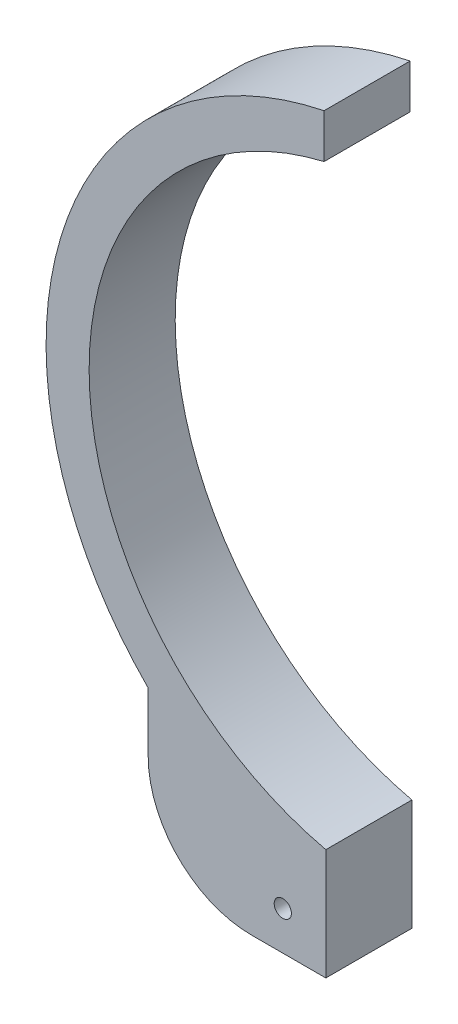
ISO-10303-21;
HEADER;
FILE_DESCRIPTION(('STEP AP214'),'2;1');
FILE_NAME('part.step','',(''),(''),'','','');
FILE_SCHEMA(('AUTOMOTIVE_DESIGN { 1 0 10303 214 1 1 1 1 }'));
ENDSEC;
DATA;
#1=APPLICATION_CONTEXT('core data for automotive mechanical design processes');
#2=APPLICATION_PROTOCOL_DEFINITION('international standard','automotive_design',2000,#1);
#3=PRODUCT_CONTEXT('',#1,'mechanical');
#4=PRODUCT('Part','Part','',(#3));
#5=PRODUCT_RELATED_PRODUCT_CATEGORY('part','',(#4));
#6=PRODUCT_DEFINITION_FORMATION('','',#4);
#7=PRODUCT_DEFINITION_CONTEXT('part definition',#1,'design');
#8=PRODUCT_DEFINITION('design','',#6,#7);
#9=PRODUCT_DEFINITION_SHAPE('','',#8);
#10=(LENGTH_UNIT() NAMED_UNIT(*) SI_UNIT(.MILLI.,.METRE.));
#11=(NAMED_UNIT(*) PLANE_ANGLE_UNIT() SI_UNIT($,.RADIAN.));
#12=(NAMED_UNIT(*) SI_UNIT($,.STERADIAN.) SOLID_ANGLE_UNIT());
#13=UNCERTAINTY_MEASURE_WITH_UNIT(LENGTH_MEASURE(1.E-05),#10,'distance_accuracy_value','');
#14=(GEOMETRIC_REPRESENTATION_CONTEXT(3) GLOBAL_UNCERTAINTY_ASSIGNED_CONTEXT((#13)) GLOBAL_UNIT_ASSIGNED_CONTEXT((#10,
#11,#12)) REPRESENTATION_CONTEXT('',''));
#15=CARTESIAN_POINT('',(0.,0.,0.));
#16=DIRECTION('',(0.,0.,1.));
#17=DIRECTION('',(1.,0.,0.));
#18=AXIS2_PLACEMENT_3D('',#15,#16,#17);
#19=CARTESIAN_POINT('',(0.,-47.5,10.));
#20=DIRECTION('',(0.,1.,0.));
#21=DIRECTION('',(0.,0.,1.));
#22=AXIS2_PLACEMENT_3D('',#19,#20,#21);
#23=PLANE('',#22);
#24=DIRECTION('',(1.,0.,0.));
#25=VECTOR('',#24,1.);
#26=CARTESIAN_POINT('',(0.,-47.5,0.));
#27=LINE('',#26,#25);
#28=CARTESIAN_POINT('',(-16.6378246380552,-47.5,0.));
#29=VERTEX_POINT('',#28);
#30=CARTESIAN_POINT('',(-8.,-47.5,0.));
#31=VERTEX_POINT('',#30);
#32=EDGE_CURVE('E129',#29,#31,#27,.T.);
#33=ORIENTED_EDGE('',*,*,#32,.T.);
#34=DIRECTION('',(0.,0.,-1.));
#35=VECTOR('',#34,1.);
#36=CARTESIAN_POINT('',(-8.,-47.5,10.));
#37=LINE('',#36,#35);
#38=CARTESIAN_POINT('',(-8.,-47.5,10.));
#39=VERTEX_POINT('',#38);
#40=EDGE_CURVE('E42',#39,#31,#37,.T.);
#41=ORIENTED_EDGE('',*,*,#40,.F.);
#42=DIRECTION('',(1.,0.,0.));
#43=VECTOR('',#42,1.);
#44=CARTESIAN_POINT('',(0.,-47.5,10.));
#45=LINE('',#44,#43);
#46=CARTESIAN_POINT('',(-16.6378246380552,-47.5,10.));
#47=VERTEX_POINT('',#46);
#48=EDGE_CURVE('E87',#47,#39,#45,.T.);
#49=ORIENTED_EDGE('',*,*,#48,.F.);
#50=DIRECTION('',(0.,0.,-1.));
#51=VECTOR('',#50,1.);
#52=CARTESIAN_POINT('',(-16.6378246380552,-47.5,10.));
#53=LINE('',#52,#51);
#54=EDGE_CURVE('E122',#47,#29,#53,.T.);
#55=ORIENTED_EDGE('',*,*,#54,.T.);
#56=EDGE_LOOP('',(#33,#41,#49,#55));
#57=FACE_BOUND('',#56,.T.);
#58=ADVANCED_FACE('F34',(#57),#23,.F.);
#59=CARTESIAN_POINT('',(-8.00000000000001,0.,10.));
#60=DIRECTION('',(1.,0.,0.));
#61=DIRECTION('',(0.,1.,0.));
#62=AXIS2_PLACEMENT_3D('',#59,#60,#61);
#63=PLANE('',#62);
#64=DIRECTION('',(0.,-1.,0.));
#65=VECTOR('',#64,1.);
#66=CARTESIAN_POINT('',(-8.00000000000001,0.,0.));
#67=LINE('',#66,#65);
#68=CARTESIAN_POINT('',(-8.,-34.5868472110425,0.));
#69=VERTEX_POINT('',#68);
#70=EDGE_CURVE('E132',#69,#31,#67,.T.);
#71=ORIENTED_EDGE('',*,*,#70,.F.);
#72=DIRECTION('',(0.,0.,-1.));
#73=VECTOR('',#72,1.);
#74=CARTESIAN_POINT('',(-8.,-34.5868472110425,10.));
#75=LINE('',#74,#73);
#76=CARTESIAN_POINT('',(-8.,-34.5868472110425,10.));
#77=VERTEX_POINT('',#76);
#78=EDGE_CURVE('E117',#77,#69,#75,.T.);
#79=ORIENTED_EDGE('',*,*,#78,.F.);
#80=DIRECTION('',(0.,-1.,0.));
#81=VECTOR('',#80,1.);
#82=CARTESIAN_POINT('',(-8.00000000000001,0.,10.));
#83=LINE('',#82,#81);
#84=EDGE_CURVE('E150',#77,#39,#83,.T.);
#85=ORIENTED_EDGE('',*,*,#84,.T.);
#86=ORIENTED_EDGE('',*,*,#40,.T.);
#87=EDGE_LOOP('',(#71,#79,#85,#86));
#88=FACE_BOUND('',#87,.T.);
#89=ADVANCED_FACE('F148',(#88),#63,.T.);
#90=CARTESIAN_POINT('',(0.,0.,10.));
#91=DIRECTION('',(0.,0.,-1.));
#92=DIRECTION('',(-1.,0.,0.));
#93=AXIS2_PLACEMENT_3D('',#90,#91,#92);
#94=CYLINDRICAL_SURFACE('',#93,35.5);
#95=DIRECTION('',(0.,0.,-1.));
#96=VECTOR('',#95,1.);
#97=CARTESIAN_POINT('',(-8.20400235630876,34.5390264098118,10.));
#98=LINE('',#97,#96);
#99=CARTESIAN_POINT('',(-8.20400235630876,34.5390264098118,10.));
#100=VERTEX_POINT('',#99);
#101=CARTESIAN_POINT('',(-8.20400235630876,34.5390264098118,0.));
#102=VERTEX_POINT('',#101);
#103=EDGE_CURVE('E49',#100,#102,#98,.T.);
#104=ORIENTED_EDGE('',*,*,#103,.F.);
#105=CARTESIAN_POINT('',(0.,0.,10.));
#106=DIRECTION('',(0.,0.,1.));
#107=DIRECTION('',(1.,0.,0.));
#108=AXIS2_PLACEMENT_3D('',#105,#106,#107);
#109=CIRCLE('',#108,35.5);
#110=EDGE_CURVE('E108',#100,#77,#109,.T.);
#111=ORIENTED_EDGE('',*,*,#110,.T.);
#112=ORIENTED_EDGE('',*,*,#78,.T.);
#113=CARTESIAN_POINT('',(0.,0.,0.));
#114=DIRECTION('',(0.,0.,1.));
#115=DIRECTION('',(1.,0.,0.));
#116=AXIS2_PLACEMENT_3D('',#113,#114,#115);
#117=CIRCLE('',#116,35.5);
#118=EDGE_CURVE('E135',#102,#69,#117,.T.);
#119=ORIENTED_EDGE('',*,*,#118,.F.);
#120=EDGE_LOOP('',(#104,#111,#112,#119));
#121=FACE_BOUND('',#120,.T.);
#122=ADVANCED_FACE('F157',(#121),#94,.F.);
#123=CARTESIAN_POINT('',(0.,0.,10.));
#124=DIRECTION('',(0.,0.,-1.));
#125=DIRECTION('',(-1.,0.,0.));
#126=AXIS2_PLACEMENT_3D('',#123,#124,#125);
#127=CYLINDRICAL_SURFACE('',#126,40.5);
#128=CARTESIAN_POINT('',(0.,0.,10.));
#129=DIRECTION('',(0.,0.,1.));
#130=DIRECTION('',(1.,0.,0.));
#131=AXIS2_PLACEMENT_3D('',#128,#129,#130);
#132=CIRCLE('',#131,40.5);
#133=CARTESIAN_POINT('',(-8.20400235630876,39.6603623954406,10.));
#134=VERTEX_POINT('',#133);
#135=CARTESIAN_POINT('',(-28.6378246380552,-28.6378246380552,10.));
#136=VERTEX_POINT('',#135);
#137=EDGE_CURVE('E96',#134,#136,#132,.T.);
#138=ORIENTED_EDGE('',*,*,#137,.F.);
#139=DIRECTION('',(0.,0.,-1.));
#140=VECTOR('',#139,1.);
#141=CARTESIAN_POINT('',(-8.20400235630876,39.6603623954406,10.));
#142=LINE('',#141,#140);
#143=CARTESIAN_POINT('',(-8.20400235630876,39.6603623954406,0.));
#144=VERTEX_POINT('',#143);
#145=EDGE_CURVE('E165',#134,#144,#142,.T.);
#146=ORIENTED_EDGE('',*,*,#145,.T.);
#147=CARTESIAN_POINT('',(0.,0.,0.));
#148=DIRECTION('',(0.,0.,1.));
#149=DIRECTION('',(1.,0.,0.));
#150=AXIS2_PLACEMENT_3D('',#147,#148,#149);
#151=CIRCLE('',#150,40.5);
#152=CARTESIAN_POINT('',(-28.6378246380552,-28.6378246380552,0.));
#153=VERTEX_POINT('',#152);
#154=EDGE_CURVE('E114',#144,#153,#151,.T.);
#155=ORIENTED_EDGE('',*,*,#154,.T.);
#156=DIRECTION('',(0.,0.,-1.));
#157=VECTOR('',#156,1.);
#158=CARTESIAN_POINT('',(-28.6378246380552,-28.6378246380552,10.));
#159=LINE('',#158,#157);
#160=EDGE_CURVE('E111',#136,#153,#159,.T.);
#161=ORIENTED_EDGE('',*,*,#160,.F.);
#162=EDGE_LOOP('',(#138,#146,#155,#161));
#163=FACE_BOUND('',#162,.T.);
#164=ADVANCED_FACE('F112',(#163),#127,.T.);
#165=CARTESIAN_POINT('',(-28.6378246380552,0.,10.));
#166=DIRECTION('',(1.,0.,0.));
#167=DIRECTION('',(0.,1.,0.));
#168=AXIS2_PLACEMENT_3D('',#165,#166,#167);
#169=PLANE('',#168);
#170=DIRECTION('',(0.,-1.,0.));
#171=VECTOR('',#170,1.);
#172=CARTESIAN_POINT('',(-28.6378246380552,0.,0.));
#173=LINE('',#172,#171);
#174=CARTESIAN_POINT('',(-28.6378246380552,-35.5,0.));
#175=VERTEX_POINT('',#174);
#176=EDGE_CURVE('E138',#153,#175,#173,.T.);
#177=ORIENTED_EDGE('',*,*,#176,.T.);
#178=DIRECTION('',(0.,0.,-1.));
#179=VECTOR('',#178,1.);
#180=CARTESIAN_POINT('',(-28.6378246380552,-35.5,10.));
#181=LINE('',#180,#179);
#182=CARTESIAN_POINT('',(-28.6378246380552,-35.5,10.));
#183=VERTEX_POINT('',#182);
#184=EDGE_CURVE('E118',#183,#175,#181,.T.);
#185=ORIENTED_EDGE('',*,*,#184,.F.);
#186=DIRECTION('',(0.,-1.,0.));
#187=VECTOR('',#186,1.);
#188=CARTESIAN_POINT('',(-28.6378246380552,0.,10.));
#189=LINE('',#188,#187);
#190=EDGE_CURVE('E101',#136,#183,#189,.T.);
#191=ORIENTED_EDGE('',*,*,#190,.F.);
#192=ORIENTED_EDGE('',*,*,#160,.T.);
#193=EDGE_LOOP('',(#177,#185,#191,#192));
#194=FACE_BOUND('',#193,.T.);
#195=ADVANCED_FACE('F120',(#194),#169,.F.);
#196=CARTESIAN_POINT('',(-13.,-42.9998768280213,10.));
#197=DIRECTION('',(0.,0.,-1.));
#198=DIRECTION('',(-1.,0.,0.));
#199=AXIS2_PLACEMENT_3D('',#196,#197,#198);
#200=CYLINDRICAL_SURFACE('',#199,1.);
#201=CARTESIAN_POINT('',(-13.,-42.9998768280213,10.));
#202=DIRECTION('',(0.,0.,1.));
#203=DIRECTION('',(1.,0.,0.));
#204=AXIS2_PLACEMENT_3D('',#201,#202,#203);
#205=CIRCLE('',#204,1.);
#206=CARTESIAN_POINT('',(-12.,-42.9998768280213,10.));
#207=VERTEX_POINT('',#206);
#208=EDGE_CURVE('E141',#207,#207,#205,.T.);
#209=ORIENTED_EDGE('',*,*,#208,.T.);
#210=EDGE_LOOP('',(#209));
#211=FACE_BOUND('',#210,.T.);
#212=CARTESIAN_POINT('',(-13.,-42.9998768280213,0.));
#213=DIRECTION('',(0.,0.,1.));
#214=DIRECTION('',(1.,0.,0.));
#215=AXIS2_PLACEMENT_3D('',#212,#213,#214);
#216=CIRCLE('',#215,1.);
#217=CARTESIAN_POINT('',(-12.,-42.9998768280213,0.));
#218=VERTEX_POINT('',#217);
#219=EDGE_CURVE('E126',#218,#218,#216,.T.);
#220=ORIENTED_EDGE('',*,*,#219,.F.);
#221=EDGE_LOOP('',(#220));
#222=FACE_BOUND('',#221,.T.);
#223=ADVANCED_FACE('F36',(#211,#222),#200,.F.);
#224=CARTESIAN_POINT('',(-16.6378246380552,-35.5,10.));
#225=DIRECTION('',(0.,0.,-1.));
#226=DIRECTION('',(-1.,0.,0.));
#227=AXIS2_PLACEMENT_3D('',#224,#225,#226);
#228=CYLINDRICAL_SURFACE('',#227,12.);
#229=CARTESIAN_POINT('',(-16.6378246380552,-35.5,0.));
#230=DIRECTION('',(0.,0.,1.));
#231=DIRECTION('',(1.,0.,0.));
#232=AXIS2_PLACEMENT_3D('',#229,#230,#231);
#233=CIRCLE('',#232,12.);
#234=EDGE_CURVE('E81',#175,#29,#233,.T.);
#235=ORIENTED_EDGE('',*,*,#234,.T.);
#236=ORIENTED_EDGE('',*,*,#54,.F.);
#237=CARTESIAN_POINT('',(-16.6378246380552,-35.5,10.));
#238=DIRECTION('',(0.,0.,1.));
#239=DIRECTION('',(1.,0.,0.));
#240=AXIS2_PLACEMENT_3D('',#237,#238,#239);
#241=CIRCLE('',#240,12.);
#242=EDGE_CURVE('E57',#183,#47,#241,.T.);
#243=ORIENTED_EDGE('',*,*,#242,.F.);
#244=ORIENTED_EDGE('',*,*,#184,.T.);
#245=EDGE_LOOP('',(#235,#236,#243,#244));
#246=FACE_BOUND('',#245,.T.);
#247=ADVANCED_FACE('F170',(#246),#228,.T.);
#248=CARTESIAN_POINT('',(0.,0.,10.));
#249=DIRECTION('',(0.,0.,1.));
#250=DIRECTION('',(1.,0.,0.));
#251=AXIS2_PLACEMENT_3D('',#248,#249,#250);
#252=PLANE('',#251);
#253=DIRECTION('',(0.,-1.,0.));
#254=VECTOR('',#253,1.);
#255=CARTESIAN_POINT('',(-8.20400235630876,40.5,10.));
#256=LINE('',#255,#254);
#257=EDGE_CURVE('E105',#134,#100,#256,.T.);
#258=ORIENTED_EDGE('',*,*,#257,.F.);
#259=ORIENTED_EDGE('',*,*,#137,.T.);
#260=ORIENTED_EDGE('',*,*,#190,.T.);
#261=ORIENTED_EDGE('',*,*,#242,.T.);
#262=ORIENTED_EDGE('',*,*,#48,.T.);
#263=ORIENTED_EDGE('',*,*,#84,.F.);
#264=ORIENTED_EDGE('',*,*,#110,.F.);
#265=EDGE_LOOP('',(#258,#259,#260,#261,#262,#263,#264));
#266=FACE_BOUND('',#265,.T.);
#267=ORIENTED_EDGE('',*,*,#208,.F.);
#268=EDGE_LOOP('',(#267));
#269=FACE_BOUND('',#268,.T.);
#270=ADVANCED_FACE('F98',(#266,#269),#252,.T.);
#271=CARTESIAN_POINT('',(0.,0.,0.));
#272=DIRECTION('',(0.,0.,1.));
#273=DIRECTION('',(1.,0.,0.));
#274=AXIS2_PLACEMENT_3D('',#271,#272,#273);
#275=PLANE('',#274);
#276=ORIENTED_EDGE('',*,*,#219,.T.);
#277=EDGE_LOOP('',(#276));
#278=FACE_BOUND('',#277,.T.);
#279=ORIENTED_EDGE('',*,*,#154,.F.);
#280=DIRECTION('',(0.,-1.,0.));
#281=VECTOR('',#280,1.);
#282=CARTESIAN_POINT('',(-8.20400235630876,0.,0.));
#283=LINE('',#282,#281);
#284=EDGE_CURVE('E11',#144,#102,#283,.T.);
#285=ORIENTED_EDGE('',*,*,#284,.T.);
#286=ORIENTED_EDGE('',*,*,#118,.T.);
#287=ORIENTED_EDGE('',*,*,#70,.T.);
#288=ORIENTED_EDGE('',*,*,#32,.F.);
#289=ORIENTED_EDGE('',*,*,#234,.F.);
#290=ORIENTED_EDGE('',*,*,#176,.F.);
#291=EDGE_LOOP('',(#279,#285,#286,#287,#288,#289,#290));
#292=FACE_BOUND('',#291,.T.);
#293=ADVANCED_FACE('F154',(#278,#292),#275,.F.);
#294=CARTESIAN_POINT('',(-8.20400235630876,40.5,0.));
#295=DIRECTION('',(-1.,0.,0.));
#296=DIRECTION('',(0.,0.,1.));
#297=AXIS2_PLACEMENT_3D('',#294,#295,#296);
#298=PLANE('',#297);
#299=ORIENTED_EDGE('',*,*,#103,.T.);
#300=ORIENTED_EDGE('',*,*,#284,.F.);
#301=ORIENTED_EDGE('',*,*,#145,.F.);
#302=ORIENTED_EDGE('',*,*,#257,.T.);
#303=EDGE_LOOP('',(#299,#300,#301,#302));
#304=FACE_BOUND('',#303,.T.);
#305=ADVANCED_FACE('F168',(#304),#298,.F.);
#306=CLOSED_SHELL('',(#58,#89,#122,#164,#195,#223,#247,#270,#293,#305));
#307=MANIFOLD_SOLID_BREP('B2',#306);
#308=ADVANCED_BREP_SHAPE_REPRESENTATION('',(#18,#307),#14);
#309=SHAPE_DEFINITION_REPRESENTATION(#9,#308);
ENDSEC;
END-ISO-10303-21;
